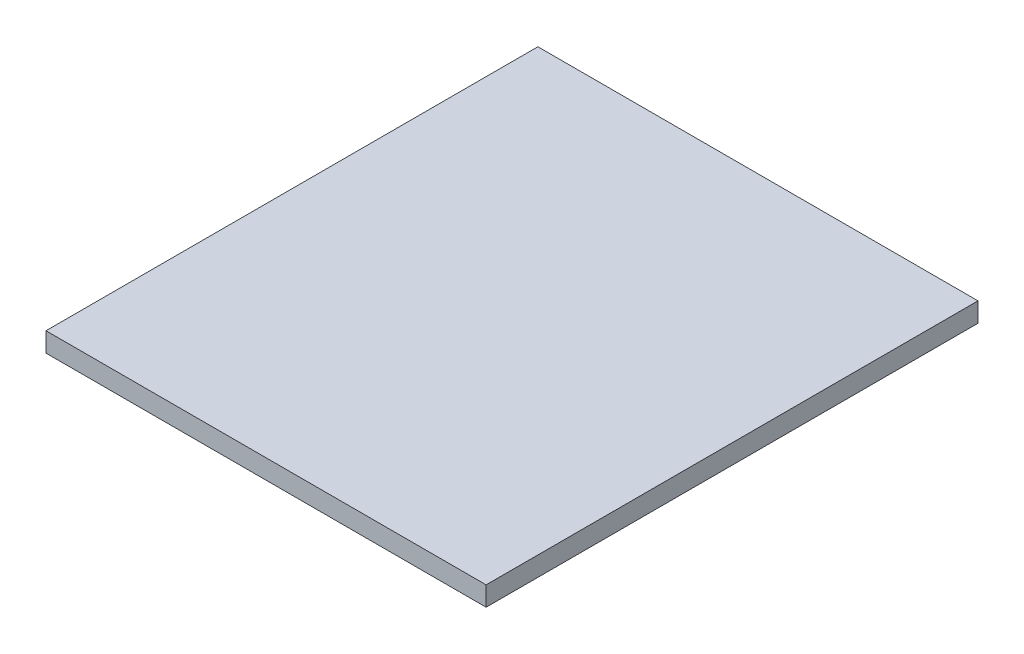
ISO-10303-21;
HEADER;
FILE_DESCRIPTION(('STEP AP214'),'2;1');
FILE_NAME('part.step','',(''),(''),'','','');
FILE_SCHEMA(('AUTOMOTIVE_DESIGN { 1 0 10303 214 1 1 1 1 }'));
ENDSEC;
DATA;
#1=APPLICATION_CONTEXT('core data for automotive mechanical design processes');
#2=APPLICATION_PROTOCOL_DEFINITION('international standard','automotive_design',2000,#1);
#3=PRODUCT_CONTEXT('',#1,'mechanical');
#4=PRODUCT('Part','Part','',(#3));
#5=PRODUCT_RELATED_PRODUCT_CATEGORY('part','',(#4));
#6=PRODUCT_DEFINITION_FORMATION('','',#4);
#7=PRODUCT_DEFINITION_CONTEXT('part definition',#1,'design');
#8=PRODUCT_DEFINITION('design','',#6,#7);
#9=PRODUCT_DEFINITION_SHAPE('','',#8);
#10=(LENGTH_UNIT() NAMED_UNIT(*) SI_UNIT(.MILLI.,.METRE.));
#11=(NAMED_UNIT(*) PLANE_ANGLE_UNIT() SI_UNIT($,.RADIAN.));
#12=(NAMED_UNIT(*) SI_UNIT($,.STERADIAN.) SOLID_ANGLE_UNIT());
#13=UNCERTAINTY_MEASURE_WITH_UNIT(LENGTH_MEASURE(1.E-05),#10,'distance_accuracy_value','');
#14=(GEOMETRIC_REPRESENTATION_CONTEXT(3) GLOBAL_UNCERTAINTY_ASSIGNED_CONTEXT((#13)) GLOBAL_UNIT_ASSIGNED_CONTEXT((#10,
#11,#12)) REPRESENTATION_CONTEXT('',''));
#15=CARTESIAN_POINT('',(0.,0.,0.));
#16=DIRECTION('',(0.,0.,1.));
#17=DIRECTION('',(1.,0.,0.));
#18=AXIS2_PLACEMENT_3D('',#15,#16,#17);
#19=CARTESIAN_POINT('',(340.,30.,-380.));
#20=DIRECTION('',(-1.,0.,0.));
#21=DIRECTION('',(0.,0.,1.));
#22=AXIS2_PLACEMENT_3D('',#19,#20,#21);
#23=PLANE('',#22);
#24=DIRECTION('',(0.,0.,-1.));
#25=VECTOR('',#24,1.);
#26=CARTESIAN_POINT('',(340.,0.,-380.));
#27=LINE('',#26,#25);
#28=CARTESIAN_POINT('',(340.,0.,380.));
#29=VERTEX_POINT('',#28);
#30=CARTESIAN_POINT('',(340.,0.,-380.));
#31=VERTEX_POINT('',#30);
#32=EDGE_CURVE('E97',#29,#31,#27,.T.);
#33=ORIENTED_EDGE('',*,*,#32,.T.);
#34=DIRECTION('',(0.,-1.,0.));
#35=VECTOR('',#34,1.);
#36=CARTESIAN_POINT('',(340.,30.,-380.));
#37=LINE('',#36,#35);
#38=CARTESIAN_POINT('',(340.,30.,-380.));
#39=VERTEX_POINT('',#38);
#40=EDGE_CURVE('E11',#39,#31,#37,.T.);
#41=ORIENTED_EDGE('',*,*,#40,.F.);
#42=DIRECTION('',(0.,0.,-1.));
#43=VECTOR('',#42,1.);
#44=CARTESIAN_POINT('',(340.,30.,-380.));
#45=LINE('',#44,#43);
#46=CARTESIAN_POINT('',(340.,30.,380.));
#47=VERTEX_POINT('',#46);
#48=EDGE_CURVE('E85',#47,#39,#45,.T.);
#49=ORIENTED_EDGE('',*,*,#48,.F.);
#50=DIRECTION('',(0.,-1.,0.));
#51=VECTOR('',#50,1.);
#52=CARTESIAN_POINT('',(340.,30.,380.));
#53=LINE('',#52,#51);
#54=EDGE_CURVE('E93',#47,#29,#53,.T.);
#55=ORIENTED_EDGE('',*,*,#54,.T.);
#56=EDGE_LOOP('',(#33,#41,#49,#55));
#57=FACE_BOUND('',#56,.T.);
#58=ADVANCED_FACE('F34',(#57),#23,.F.);
#59=CARTESIAN_POINT('',(-340.,30.,-380.));
#60=DIRECTION('',(0.,0.,1.));
#61=DIRECTION('',(1.,0.,0.));
#62=AXIS2_PLACEMENT_3D('',#59,#60,#61);
#63=PLANE('',#62);
#64=DIRECTION('',(-1.,0.,0.));
#65=VECTOR('',#64,1.);
#66=CARTESIAN_POINT('',(-340.,0.,-380.));
#67=LINE('',#66,#65);
#68=CARTESIAN_POINT('',(-340.,0.,-380.));
#69=VERTEX_POINT('',#68);
#70=EDGE_CURVE('E89',#31,#69,#67,.T.);
#71=ORIENTED_EDGE('',*,*,#70,.T.);
#72=DIRECTION('',(0.,-1.,0.));
#73=VECTOR('',#72,1.);
#74=CARTESIAN_POINT('',(-340.,30.,-380.));
#75=LINE('',#74,#73);
#76=CARTESIAN_POINT('',(-340.,30.,-380.));
#77=VERTEX_POINT('',#76);
#78=EDGE_CURVE('E42',#77,#69,#75,.T.);
#79=ORIENTED_EDGE('',*,*,#78,.F.);
#80=DIRECTION('',(-1.,0.,0.));
#81=VECTOR('',#80,1.);
#82=CARTESIAN_POINT('',(-340.,30.,-380.));
#83=LINE('',#82,#81);
#84=EDGE_CURVE('E80',#39,#77,#83,.T.);
#85=ORIENTED_EDGE('',*,*,#84,.F.);
#86=ORIENTED_EDGE('',*,*,#40,.T.);
#87=EDGE_LOOP('',(#71,#79,#85,#86));
#88=FACE_BOUND('',#87,.T.);
#89=ADVANCED_FACE('F88',(#88),#63,.F.);
#90=CARTESIAN_POINT('',(-340.,30.,-380.));
#91=DIRECTION('',(1.,0.,0.));
#92=DIRECTION('',(0.,0.,-1.));
#93=AXIS2_PLACEMENT_3D('',#90,#91,#92);
#94=PLANE('',#93);
#95=DIRECTION('',(0.,0.,1.));
#96=VECTOR('',#95,1.);
#97=CARTESIAN_POINT('',(-340.,0.,-380.));
#98=LINE('',#97,#96);
#99=CARTESIAN_POINT('',(-340.,0.,380.));
#100=VERTEX_POINT('',#99);
#101=EDGE_CURVE('E67',#69,#100,#98,.T.);
#102=ORIENTED_EDGE('',*,*,#101,.T.);
#103=DIRECTION('',(0.,-1.,0.));
#104=VECTOR('',#103,1.);
#105=CARTESIAN_POINT('',(-340.,30.,380.));
#106=LINE('',#105,#104);
#107=CARTESIAN_POINT('',(-340.,30.,380.));
#108=VERTEX_POINT('',#107);
#109=EDGE_CURVE('E90',#108,#100,#106,.T.);
#110=ORIENTED_EDGE('',*,*,#109,.F.);
#111=DIRECTION('',(0.,0.,1.));
#112=VECTOR('',#111,1.);
#113=CARTESIAN_POINT('',(-340.,30.,-380.));
#114=LINE('',#113,#112);
#115=EDGE_CURVE('E83',#77,#108,#114,.T.);
#116=ORIENTED_EDGE('',*,*,#115,.F.);
#117=ORIENTED_EDGE('',*,*,#78,.T.);
#118=EDGE_LOOP('',(#102,#110,#116,#117));
#119=FACE_BOUND('',#118,.T.);
#120=ADVANCED_FACE('F91',(#119),#94,.F.);
#121=CARTESIAN_POINT('',(-340.,30.,380.));
#122=DIRECTION('',(0.,0.,-1.));
#123=DIRECTION('',(-1.,0.,0.));
#124=AXIS2_PLACEMENT_3D('',#121,#122,#123);
#125=PLANE('',#124);
#126=DIRECTION('',(1.,0.,0.));
#127=VECTOR('',#126,1.);
#128=CARTESIAN_POINT('',(-340.,0.,380.));
#129=LINE('',#128,#127);
#130=EDGE_CURVE('E73',#100,#29,#129,.T.);
#131=ORIENTED_EDGE('',*,*,#130,.T.);
#132=ORIENTED_EDGE('',*,*,#54,.F.);
#133=DIRECTION('',(1.,0.,0.));
#134=VECTOR('',#133,1.);
#135=CARTESIAN_POINT('',(-340.,30.,380.));
#136=LINE('',#135,#134);
#137=EDGE_CURVE('E50',#108,#47,#136,.T.);
#138=ORIENTED_EDGE('',*,*,#137,.F.);
#139=ORIENTED_EDGE('',*,*,#109,.T.);
#140=EDGE_LOOP('',(#131,#132,#138,#139));
#141=FACE_BOUND('',#140,.T.);
#142=ADVANCED_FACE('F104',(#141),#125,.F.);
#143=CARTESIAN_POINT('',(0.,30.,0.));
#144=DIRECTION('',(0.,1.,0.));
#145=DIRECTION('',(0.,0.,1.));
#146=AXIS2_PLACEMENT_3D('',#143,#144,#145);
#147=PLANE('',#146);
#148=ORIENTED_EDGE('',*,*,#48,.T.);
#149=ORIENTED_EDGE('',*,*,#84,.T.);
#150=ORIENTED_EDGE('',*,*,#115,.T.);
#151=ORIENTED_EDGE('',*,*,#137,.T.);
#152=EDGE_LOOP('',(#148,#149,#150,#151));
#153=FACE_BOUND('',#152,.T.);
#154=ADVANCED_FACE('F81',(#153),#147,.T.);
#155=CARTESIAN_POINT('',(0.,0.,0.));
#156=DIRECTION('',(0.,1.,0.));
#157=DIRECTION('',(0.,0.,1.));
#158=AXIS2_PLACEMENT_3D('',#155,#156,#157);
#159=PLANE('',#158);
#160=ORIENTED_EDGE('',*,*,#32,.F.);
#161=ORIENTED_EDGE('',*,*,#130,.F.);
#162=ORIENTED_EDGE('',*,*,#101,.F.);
#163=ORIENTED_EDGE('',*,*,#70,.F.);
#164=EDGE_LOOP('',(#160,#161,#162,#163));
#165=FACE_BOUND('',#164,.T.);
#166=ADVANCED_FACE('F107',(#165),#159,.F.);
#167=CLOSED_SHELL('',(#58,#89,#120,#142,#154,#166));
#168=MANIFOLD_SOLID_BREP('B2',#167);
#169=ADVANCED_BREP_SHAPE_REPRESENTATION('',(#18,#168),#14);
#170=SHAPE_DEFINITION_REPRESENTATION(#9,#169);
ENDSEC;
END-ISO-10303-21;
